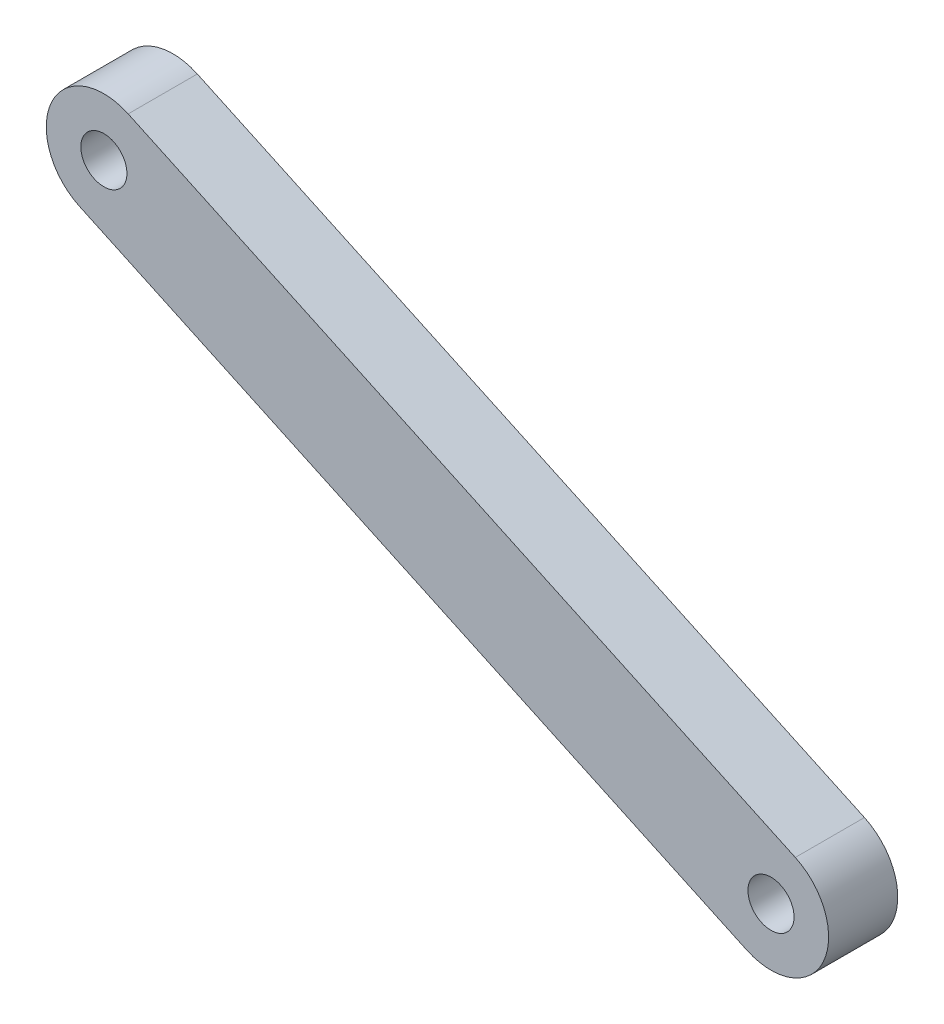
ISO-10303-21;
HEADER;
FILE_DESCRIPTION(('STEP AP214'),'2;1');
FILE_NAME('part.step','',(''),(''),'','','');
FILE_SCHEMA(('AUTOMOTIVE_DESIGN { 1 0 10303 214 1 1 1 1 }'));
ENDSEC;
DATA;
#1=APPLICATION_CONTEXT('core data for automotive mechanical design processes');
#2=APPLICATION_PROTOCOL_DEFINITION('international standard','automotive_design',2000,#1);
#3=PRODUCT_CONTEXT('',#1,'mechanical');
#4=PRODUCT('Part','Part','',(#3));
#5=PRODUCT_RELATED_PRODUCT_CATEGORY('part','',(#4));
#6=PRODUCT_DEFINITION_FORMATION('','',#4);
#7=PRODUCT_DEFINITION_CONTEXT('part definition',#1,'design');
#8=PRODUCT_DEFINITION('design','',#6,#7);
#9=PRODUCT_DEFINITION_SHAPE('','',#8);
#10=(LENGTH_UNIT() NAMED_UNIT(*) SI_UNIT(.MILLI.,.METRE.));
#11=(NAMED_UNIT(*) PLANE_ANGLE_UNIT() SI_UNIT($,.RADIAN.));
#12=(NAMED_UNIT(*) SI_UNIT($,.STERADIAN.) SOLID_ANGLE_UNIT());
#13=UNCERTAINTY_MEASURE_WITH_UNIT(LENGTH_MEASURE(1.E-05),#10,'distance_accuracy_value','');
#14=(GEOMETRIC_REPRESENTATION_CONTEXT(3) GLOBAL_UNCERTAINTY_ASSIGNED_CONTEXT((#13)) GLOBAL_UNIT_ASSIGNED_CONTEXT((#10,
#11,#12)) REPRESENTATION_CONTEXT('',''));
#15=CARTESIAN_POINT('',(0.,0.,0.));
#16=DIRECTION('',(0.,0.,1.));
#17=DIRECTION('',(1.,0.,0.));
#18=AXIS2_PLACEMENT_3D('',#15,#16,#17);
#19=CARTESIAN_POINT('',(-20.6555406612858,56.1798703776775,3.));
#20=DIRECTION('',(0.,0.,1.));
#21=DIRECTION('',(1.,0.,0.));
#22=AXIS2_PLACEMENT_3D('',#19,#20,#21);
#23=PLANE('',#22);
#24=CARTESIAN_POINT('',(8.29436111100794,42.7113606002241,3.));
#25=DIRECTION('',(0.,0.,1.));
#26=DIRECTION('',(1.,0.,0.));
#27=AXIS2_PLACEMENT_3D('',#24,#25,#26);
#28=CIRCLE('',#27,1.);
#29=CARTESIAN_POINT('',(9.29436111100794,42.7113606002241,3.));
#30=VERTEX_POINT('',#29);
#31=EDGE_CURVE('E102',#30,#30,#28,.T.);
#32=ORIENTED_EDGE('',*,*,#31,.F.);
#33=EDGE_LOOP('',(#32));
#34=FACE_BOUND('',#33,.T.);
#35=CARTESIAN_POINT('',(-20.6555406612858,56.1798703776775,3.));
#36=DIRECTION('',(0.,0.,1.));
#37=DIRECTION('',(1.,0.,0.));
#38=AXIS2_PLACEMENT_3D('',#35,#36,#37);
#39=CIRCLE('',#38,2.50000000000001);
#40=CARTESIAN_POINT('',(-19.6009924061073,58.4465701763937,3.));
#41=VERTEX_POINT('',#40);
#42=CARTESIAN_POINT('',(-21.7100889164642,53.9131705789614,3.));
#43=VERTEX_POINT('',#42);
#44=EDGE_CURVE('E87',#41,#43,#39,.T.);
#45=ORIENTED_EDGE('',*,*,#44,.T.);
#46=DIRECTION('',(0.906679919486476,-0.421819302071394,0.));
#47=VECTOR('',#46,1.);
#48=CARTESIAN_POINT('',(-21.7100889164642,53.9131705789614,3.));
#49=LINE('',#48,#47);
#50=CARTESIAN_POINT('',(7.23981285582945,40.4446608015079,3.));
#51=VERTEX_POINT('',#50);
#52=EDGE_CURVE('E82',#43,#51,#49,.T.);
#53=ORIENTED_EDGE('',*,*,#52,.T.);
#54=CARTESIAN_POINT('',(8.29436111100794,42.7113606002241,3.));
#55=DIRECTION('',(0.,0.,1.));
#56=DIRECTION('',(1.,0.,0.));
#57=AXIS2_PLACEMENT_3D('',#54,#55,#56);
#58=CIRCLE('',#57,2.50000000000001);
#59=CARTESIAN_POINT('',(9.34890936618642,44.9780603989403,3.));
#60=VERTEX_POINT('',#59);
#61=EDGE_CURVE('E85',#51,#60,#58,.T.);
#62=ORIENTED_EDGE('',*,*,#61,.T.);
#63=DIRECTION('',(-0.906679919486476,0.421819302071394,0.));
#64=VECTOR('',#63,1.);
#65=CARTESIAN_POINT('',(-19.6009924061073,58.4465701763937,3.));
#66=LINE('',#65,#64);
#67=EDGE_CURVE('E52',#60,#41,#66,.T.);
#68=ORIENTED_EDGE('',*,*,#67,.T.);
#69=EDGE_LOOP('',(#45,#53,#62,#68));
#70=FACE_BOUND('',#69,.T.);
#71=CARTESIAN_POINT('',(-20.6555406612858,56.1798703776775,3.));
#72=DIRECTION('',(0.,0.,1.));
#73=DIRECTION('',(1.,0.,0.));
#74=AXIS2_PLACEMENT_3D('',#71,#72,#73);
#75=CIRCLE('',#74,0.999999999999998);
#76=CARTESIAN_POINT('',(-19.6555406612858,56.1798703776775,3.));
#77=VERTEX_POINT('',#76);
#78=EDGE_CURVE('E117',#77,#77,#75,.T.);
#79=ORIENTED_EDGE('',*,*,#78,.F.);
#80=EDGE_LOOP('',(#79));
#81=FACE_BOUND('',#80,.T.);
#82=ADVANCED_FACE('F35',(#34,#70,#81),#23,.T.);
#83=CARTESIAN_POINT('',(-20.6555406612858,56.1798703776775,0.));
#84=DIRECTION('',(0.,0.,1.));
#85=DIRECTION('',(1.,0.,0.));
#86=AXIS2_PLACEMENT_3D('',#83,#84,#85);
#87=PLANE('',#86);
#88=CARTESIAN_POINT('',(-20.6555406612858,56.1798703776775,0.));
#89=DIRECTION('',(0.,0.,1.));
#90=DIRECTION('',(1.,0.,0.));
#91=AXIS2_PLACEMENT_3D('',#88,#89,#90);
#92=CIRCLE('',#91,2.50000000000001);
#93=CARTESIAN_POINT('',(-19.6009924061073,58.4465701763937,0.));
#94=VERTEX_POINT('',#93);
#95=CARTESIAN_POINT('',(-21.7100889164642,53.9131705789614,0.));
#96=VERTEX_POINT('',#95);
#97=EDGE_CURVE('E99',#94,#96,#92,.T.);
#98=ORIENTED_EDGE('',*,*,#97,.F.);
#99=DIRECTION('',(-0.906679919486476,0.421819302071394,0.));
#100=VECTOR('',#99,1.);
#101=CARTESIAN_POINT('',(-19.6009924061073,58.4465701763937,0.));
#102=LINE('',#101,#100);
#103=CARTESIAN_POINT('',(9.34890936618642,44.9780603989403,0.));
#104=VERTEX_POINT('',#103);
#105=EDGE_CURVE('E75',#104,#94,#102,.T.);
#106=ORIENTED_EDGE('',*,*,#105,.F.);
#107=CARTESIAN_POINT('',(8.29436111100794,42.7113606002241,0.));
#108=DIRECTION('',(0.,0.,1.));
#109=DIRECTION('',(1.,0.,0.));
#110=AXIS2_PLACEMENT_3D('',#107,#108,#109);
#111=CIRCLE('',#110,2.50000000000001);
#112=CARTESIAN_POINT('',(7.23981285582945,40.4446608015079,0.));
#113=VERTEX_POINT('',#112);
#114=EDGE_CURVE('E69',#113,#104,#111,.T.);
#115=ORIENTED_EDGE('',*,*,#114,.F.);
#116=DIRECTION('',(0.906679919486476,-0.421819302071394,0.));
#117=VECTOR('',#116,1.);
#118=CARTESIAN_POINT('',(-21.7100889164642,53.9131705789614,0.));
#119=LINE('',#118,#117);
#120=EDGE_CURVE('E91',#96,#113,#119,.T.);
#121=ORIENTED_EDGE('',*,*,#120,.F.);
#122=EDGE_LOOP('',(#98,#106,#115,#121));
#123=FACE_BOUND('',#122,.T.);
#124=CARTESIAN_POINT('',(8.29436111100794,42.7113606002241,0.));
#125=DIRECTION('',(0.,0.,1.));
#126=DIRECTION('',(1.,0.,0.));
#127=AXIS2_PLACEMENT_3D('',#124,#125,#126);
#128=CIRCLE('',#127,1.);
#129=CARTESIAN_POINT('',(9.29436111100794,42.7113606002241,0.));
#130=VERTEX_POINT('',#129);
#131=EDGE_CURVE('E114',#130,#130,#128,.T.);
#132=ORIENTED_EDGE('',*,*,#131,.T.);
#133=EDGE_LOOP('',(#132));
#134=FACE_BOUND('',#133,.T.);
#135=CARTESIAN_POINT('',(-20.6555406612858,56.1798703776775,0.));
#136=DIRECTION('',(0.,0.,1.));
#137=DIRECTION('',(1.,0.,0.));
#138=AXIS2_PLACEMENT_3D('',#135,#136,#137);
#139=CIRCLE('',#138,0.999999999999998);
#140=CARTESIAN_POINT('',(-19.6555406612858,56.1798703776775,0.));
#141=VERTEX_POINT('',#140);
#142=EDGE_CURVE('E120',#141,#141,#139,.T.);
#143=ORIENTED_EDGE('',*,*,#142,.T.);
#144=EDGE_LOOP('',(#143));
#145=FACE_BOUND('',#144,.T.);
#146=ADVANCED_FACE('F110',(#123,#134,#145),#87,.F.);
#147=CARTESIAN_POINT('',(-20.6555406612858,56.1798703776775,3.));
#148=DIRECTION('',(0.,0.,-1.));
#149=DIRECTION('',(-1.,0.,0.));
#150=AXIS2_PLACEMENT_3D('',#147,#148,#149);
#151=CYLINDRICAL_SURFACE('',#150,2.50000000000001);
#152=ORIENTED_EDGE('',*,*,#97,.T.);
#153=DIRECTION('',(0.,0.,-1.));
#154=VECTOR('',#153,1.);
#155=CARTESIAN_POINT('',(-21.7100889164642,53.9131705789614,3.));
#156=LINE('',#155,#154);
#157=EDGE_CURVE('E11',#43,#96,#156,.T.);
#158=ORIENTED_EDGE('',*,*,#157,.F.);
#159=ORIENTED_EDGE('',*,*,#44,.F.);
#160=DIRECTION('',(0.,0.,-1.));
#161=VECTOR('',#160,1.);
#162=CARTESIAN_POINT('',(-19.6009924061073,58.4465701763937,3.));
#163=LINE('',#162,#161);
#164=EDGE_CURVE('E95',#41,#94,#163,.T.);
#165=ORIENTED_EDGE('',*,*,#164,.T.);
#166=EDGE_LOOP('',(#152,#158,#159,#165));
#167=FACE_BOUND('',#166,.T.);
#168=ADVANCED_FACE('F37',(#167),#151,.T.);
#169=CARTESIAN_POINT('',(-21.7100889164642,53.9131705789614,3.));
#170=DIRECTION('',(0.421819302071394,0.906679919486476,0.));
#171=DIRECTION('',(-0.906679919486476,0.421819302071394,0.));
#172=AXIS2_PLACEMENT_3D('',#169,#170,#171);
#173=PLANE('',#172);
#174=ORIENTED_EDGE('',*,*,#120,.T.);
#175=DIRECTION('',(0.,0.,-1.));
#176=VECTOR('',#175,1.);
#177=CARTESIAN_POINT('',(7.23981285582945,40.4446608015079,3.));
#178=LINE('',#177,#176);
#179=EDGE_CURVE('E44',#51,#113,#178,.T.);
#180=ORIENTED_EDGE('',*,*,#179,.F.);
#181=ORIENTED_EDGE('',*,*,#52,.F.);
#182=ORIENTED_EDGE('',*,*,#157,.T.);
#183=EDGE_LOOP('',(#174,#180,#181,#182));
#184=FACE_BOUND('',#183,.T.);
#185=ADVANCED_FACE('F90',(#184),#173,.F.);
#186=CARTESIAN_POINT('',(8.29436111100794,42.7113606002241,3.));
#187=DIRECTION('',(0.,0.,-1.));
#188=DIRECTION('',(-1.,0.,0.));
#189=AXIS2_PLACEMENT_3D('',#186,#187,#188);
#190=CYLINDRICAL_SURFACE('',#189,2.50000000000001);
#191=ORIENTED_EDGE('',*,*,#114,.T.);
#192=DIRECTION('',(0.,0.,-1.));
#193=VECTOR('',#192,1.);
#194=CARTESIAN_POINT('',(9.34890936618642,44.9780603989403,3.));
#195=LINE('',#194,#193);
#196=EDGE_CURVE('E92',#60,#104,#195,.T.);
#197=ORIENTED_EDGE('',*,*,#196,.F.);
#198=ORIENTED_EDGE('',*,*,#61,.F.);
#199=ORIENTED_EDGE('',*,*,#179,.T.);
#200=EDGE_LOOP('',(#191,#197,#198,#199));
#201=FACE_BOUND('',#200,.T.);
#202=ADVANCED_FACE('F93',(#201),#190,.T.);
#203=CARTESIAN_POINT('',(-19.6009924061073,58.4465701763937,3.));
#204=DIRECTION('',(-0.421819302071394,-0.906679919486476,0.));
#205=DIRECTION('',(0.906679919486476,-0.421819302071394,0.));
#206=AXIS2_PLACEMENT_3D('',#203,#204,#205);
#207=PLANE('',#206);
#208=ORIENTED_EDGE('',*,*,#105,.T.);
#209=ORIENTED_EDGE('',*,*,#164,.F.);
#210=ORIENTED_EDGE('',*,*,#67,.F.);
#211=ORIENTED_EDGE('',*,*,#196,.T.);
#212=EDGE_LOOP('',(#208,#209,#210,#211));
#213=FACE_BOUND('',#212,.T.);
#214=ADVANCED_FACE('F107',(#213),#207,.F.);
#215=CARTESIAN_POINT('',(8.29436111100794,42.7113606002241,3.));
#216=DIRECTION('',(0.,0.,-1.));
#217=DIRECTION('',(-1.,0.,0.));
#218=AXIS2_PLACEMENT_3D('',#215,#216,#217);
#219=CYLINDRICAL_SURFACE('',#218,1.);
#220=ORIENTED_EDGE('',*,*,#31,.T.);
#221=EDGE_LOOP('',(#220));
#222=FACE_BOUND('',#221,.T.);
#223=ORIENTED_EDGE('',*,*,#131,.F.);
#224=EDGE_LOOP('',(#223));
#225=FACE_BOUND('',#224,.T.);
#226=ADVANCED_FACE('F137',(#222,#225),#219,.F.);
#227=CARTESIAN_POINT('',(-20.6555406612858,56.1798703776775,3.));
#228=DIRECTION('',(0.,0.,-1.));
#229=DIRECTION('',(-1.,0.,0.));
#230=AXIS2_PLACEMENT_3D('',#227,#228,#229);
#231=CYLINDRICAL_SURFACE('',#230,0.999999999999998);
#232=ORIENTED_EDGE('',*,*,#78,.T.);
#233=EDGE_LOOP('',(#232));
#234=FACE_BOUND('',#233,.T.);
#235=ORIENTED_EDGE('',*,*,#142,.F.);
#236=EDGE_LOOP('',(#235));
#237=FACE_BOUND('',#236,.T.);
#238=ADVANCED_FACE('F126',(#234,#237),#231,.F.);
#239=CLOSED_SHELL('',(#82,#146,#168,#185,#202,#214,#226,#238));
#240=MANIFOLD_SOLID_BREP('B2',#239);
#241=ADVANCED_BREP_SHAPE_REPRESENTATION('',(#18,#240),#14);
#242=SHAPE_DEFINITION_REPRESENTATION(#9,#241);
ENDSEC;
END-ISO-10303-21;
